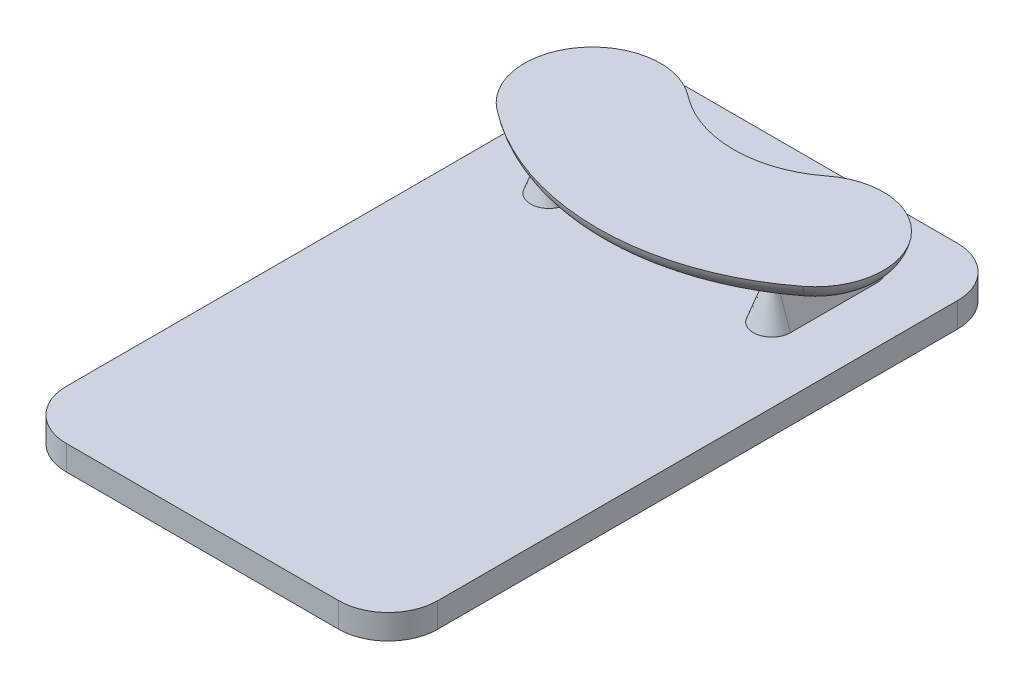
ISO-10303-21;
HEADER;
FILE_DESCRIPTION(('STEP AP214'),'2;1');
FILE_NAME('part.step','',(''),(''),'','','');
FILE_SCHEMA(('AUTOMOTIVE_DESIGN { 1 0 10303 214 1 1 1 1 }'));
ENDSEC;
DATA;
#1=APPLICATION_CONTEXT('core data for automotive mechanical design processes');
#2=APPLICATION_PROTOCOL_DEFINITION('international standard','automotive_design',2000,#1);
#3=PRODUCT_CONTEXT('',#1,'mechanical');
#4=PRODUCT('Part','Part','',(#3));
#5=PRODUCT_RELATED_PRODUCT_CATEGORY('part','',(#4));
#6=PRODUCT_DEFINITION_FORMATION('','',#4);
#7=PRODUCT_DEFINITION_CONTEXT('part definition',#1,'design');
#8=PRODUCT_DEFINITION('design','',#6,#7);
#9=PRODUCT_DEFINITION_SHAPE('','',#8);
#10=(LENGTH_UNIT() NAMED_UNIT(*) SI_UNIT(.MILLI.,.METRE.));
#11=(NAMED_UNIT(*) PLANE_ANGLE_UNIT() SI_UNIT($,.RADIAN.));
#12=(NAMED_UNIT(*) SI_UNIT($,.STERADIAN.) SOLID_ANGLE_UNIT());
#13=UNCERTAINTY_MEASURE_WITH_UNIT(LENGTH_MEASURE(1.E-05),#10,'distance_accuracy_value','');
#14=(GEOMETRIC_REPRESENTATION_CONTEXT(3) GLOBAL_UNCERTAINTY_ASSIGNED_CONTEXT((#13)) GLOBAL_UNIT_ASSIGNED_CONTEXT((#10,
#11,#12)) REPRESENTATION_CONTEXT('',''));
#15=CARTESIAN_POINT('',(0.,0.,0.));
#16=DIRECTION('',(0.,0.,1.));
#17=DIRECTION('',(1.,0.,0.));
#18=AXIS2_PLACEMENT_3D('',#15,#16,#17);
#19=CARTESIAN_POINT('',(0.,20.,0.));
#20=DIRECTION('',(0.,1.,0.));
#21=DIRECTION('',(0.,0.,1.));
#22=AXIS2_PLACEMENT_3D('',#19,#20,#21);
#23=PLANE('',#22);
#24=DIRECTION('',(1.,0.,0.));
#25=VECTOR('',#24,1.);
#26=CARTESIAN_POINT('',(-88.9739336098494,20.,413.488444626586));
#27=LINE('',#26,#25);
#28=CARTESIAN_POINT('',(-48.9739336098494,20.,413.488444626586));
#29=VERTEX_POINT('',#28);
#30=CARTESIAN_POINT('',(171.026066390151,20.,413.488444626586));
#31=VERTEX_POINT('',#30);
#32=EDGE_CURVE('E276',#29,#31,#27,.T.);
#33=ORIENTED_EDGE('',*,*,#32,.T.);
#34=CARTESIAN_POINT('',(171.026066390151,20.,373.488444626586));
#35=DIRECTION('',(0.,1.,0.));
#36=DIRECTION('',(0.,0.,1.));
#37=AXIS2_PLACEMENT_3D('',#34,#35,#36);
#38=CIRCLE('',#37,40.);
#39=CARTESIAN_POINT('',(211.026066390151,20.,373.488444626586));
#40=VERTEX_POINT('',#39);
#41=EDGE_CURVE('E333',#31,#40,#38,.T.);
#42=ORIENTED_EDGE('',*,*,#41,.T.);
#43=DIRECTION('',(0.,0.,-1.));
#44=VECTOR('',#43,1.);
#45=CARTESIAN_POINT('',(211.026066390151,20.,-86.5115553734145));
#46=LINE('',#45,#44);
#47=CARTESIAN_POINT('',(211.026066390151,20.,-46.5115553734145));
#48=VERTEX_POINT('',#47);
#49=EDGE_CURVE('E280',#40,#48,#46,.T.);
#50=ORIENTED_EDGE('',*,*,#49,.T.);
#51=CARTESIAN_POINT('',(171.026066390151,20.,-46.5115553734145));
#52=DIRECTION('',(0.,1.,0.));
#53=DIRECTION('',(0.,0.,1.));
#54=AXIS2_PLACEMENT_3D('',#51,#52,#53);
#55=CIRCLE('',#54,40.);
#56=CARTESIAN_POINT('',(171.026066390151,20.,-86.5115553734145));
#57=VERTEX_POINT('',#56);
#58=EDGE_CURVE('E303',#48,#57,#55,.T.);
#59=ORIENTED_EDGE('',*,*,#58,.T.);
#60=DIRECTION('',(-1.,0.,0.));
#61=VECTOR('',#60,1.);
#62=CARTESIAN_POINT('',(-88.9739336098494,20.,-86.5115553734145));
#63=LINE('',#62,#61);
#64=CARTESIAN_POINT('',(-48.9739336098494,20.,-86.5115553734145));
#65=VERTEX_POINT('',#64);
#66=EDGE_CURVE('E282',#57,#65,#63,.T.);
#67=ORIENTED_EDGE('',*,*,#66,.T.);
#68=CARTESIAN_POINT('',(-48.9739336098494,20.,-46.5115553734145));
#69=DIRECTION('',(0.,1.,0.));
#70=DIRECTION('',(0.,0.,1.));
#71=AXIS2_PLACEMENT_3D('',#68,#69,#70);
#72=CIRCLE('',#71,40.);
#73=CARTESIAN_POINT('',(-88.9739336098494,20.,-46.5115553734145));
#74=VERTEX_POINT('',#73);
#75=EDGE_CURVE('E313',#65,#74,#72,.T.);
#76=ORIENTED_EDGE('',*,*,#75,.T.);
#77=DIRECTION('',(0.,0.,1.));
#78=VECTOR('',#77,1.);
#79=CARTESIAN_POINT('',(-88.9739336098494,20.,-86.5115553734145));
#80=LINE('',#79,#78);
#81=CARTESIAN_POINT('',(-88.9739336098494,20.,373.488444626586));
#82=VERTEX_POINT('',#81);
#83=EDGE_CURVE('E273',#74,#82,#80,.T.);
#84=ORIENTED_EDGE('',*,*,#83,.T.);
#85=CARTESIAN_POINT('',(-48.9739336098494,20.,373.488444626586));
#86=DIRECTION('',(0.,1.,0.));
#87=DIRECTION('',(0.,0.,1.));
#88=AXIS2_PLACEMENT_3D('',#85,#86,#87);
#89=CIRCLE('',#88,40.);
#90=EDGE_CURVE('E323',#82,#29,#89,.T.);
#91=ORIENTED_EDGE('',*,*,#90,.T.);
#92=EDGE_LOOP('',(#33,#42,#50,#59,#67,#76,#84,#91));
#93=FACE_BOUND('',#92,.T.);
#94=DIRECTION('',(0.,0.,1.));
#95=VECTOR('',#94,1.);
#96=CARTESIAN_POINT('',(-43.9739336098495,20.,-26.5115553734145));
#97=LINE('',#96,#95);
#98=CARTESIAN_POINT('',(-43.9739336098495,20.,-26.5115553734145));
#99=VERTEX_POINT('',#98);
#100=CARTESIAN_POINT('',(-43.9739336098494,20.,43.4884446265855));
#101=VERTEX_POINT('',#100);
#102=EDGE_CURVE('E242',#99,#101,#97,.T.);
#103=ORIENTED_EDGE('',*,*,#102,.F.);
#104=CARTESIAN_POINT('',(-28.9739336098495,20.,-26.5115553734145));
#105=DIRECTION('',(0.,1.,0.));
#106=DIRECTION('',(0.,0.,1.));
#107=AXIS2_PLACEMENT_3D('',#104,#105,#106);
#108=CIRCLE('',#107,15.);
#109=CARTESIAN_POINT('',(-13.9739336098495,20.,-26.5115553734145));
#110=VERTEX_POINT('',#109);
#111=EDGE_CURVE('E220',#110,#99,#108,.T.);
#112=ORIENTED_EDGE('',*,*,#111,.F.);
#113=DIRECTION('',(0.,0.,-1.));
#114=VECTOR('',#113,1.);
#115=CARTESIAN_POINT('',(-13.9739336098495,20.,-26.5115553734145));
#116=LINE('',#115,#114);
#117=CARTESIAN_POINT('',(-13.9739336098494,20.,43.4884446265855));
#118=VERTEX_POINT('',#117);
#119=EDGE_CURVE('E247',#118,#110,#116,.T.);
#120=ORIENTED_EDGE('',*,*,#119,.F.);
#121=CARTESIAN_POINT('',(-28.9739336098494,20.,43.4884446265855));
#122=DIRECTION('',(0.,1.,0.));
#123=DIRECTION('',(0.,0.,1.));
#124=AXIS2_PLACEMENT_3D('',#121,#122,#123);
#125=CIRCLE('',#124,15.);
#126=EDGE_CURVE('E244',#101,#118,#125,.T.);
#127=ORIENTED_EDGE('',*,*,#126,.F.);
#128=EDGE_LOOP('',(#103,#112,#120,#127));
#129=FACE_BOUND('',#128,.T.);
#130=DIRECTION('',(0.,0.,1.));
#131=VECTOR('',#130,1.);
#132=CARTESIAN_POINT('',(136.026066390151,20.,-26.5115553734145));
#133=LINE('',#132,#131);
#134=CARTESIAN_POINT('',(136.026066390151,20.,-26.5115553734145));
#135=VERTEX_POINT('',#134);
#136=CARTESIAN_POINT('',(136.026066390151,20.,43.4884446265855));
#137=VERTEX_POINT('',#136);
#138=EDGE_CURVE('E210',#135,#137,#133,.T.);
#139=ORIENTED_EDGE('',*,*,#138,.F.);
#140=CARTESIAN_POINT('',(151.026066390151,20.,-26.5115553734145));
#141=DIRECTION('',(0.,1.,0.));
#142=DIRECTION('',(0.,0.,1.));
#143=AXIS2_PLACEMENT_3D('',#140,#141,#142);
#144=CIRCLE('',#143,15.);
#145=CARTESIAN_POINT('',(166.026066390151,20.,-26.5115553734145));
#146=VERTEX_POINT('',#145);
#147=EDGE_CURVE('E207',#146,#135,#144,.T.);
#148=ORIENTED_EDGE('',*,*,#147,.F.);
#149=DIRECTION('',(0.,0.,-1.));
#150=VECTOR('',#149,1.);
#151=CARTESIAN_POINT('',(166.026066390151,20.,-26.5115553734145));
#152=LINE('',#151,#150);
#153=CARTESIAN_POINT('',(166.026066390151,20.,43.4884446265855));
#154=VERTEX_POINT('',#153);
#155=EDGE_CURVE('E215',#154,#146,#152,.T.);
#156=ORIENTED_EDGE('',*,*,#155,.F.);
#157=CARTESIAN_POINT('',(151.026066390151,20.,43.4884446265855));
#158=DIRECTION('',(0.,1.,0.));
#159=DIRECTION('',(0.,0.,1.));
#160=AXIS2_PLACEMENT_3D('',#157,#158,#159);
#161=CIRCLE('',#160,15.);
#162=EDGE_CURVE('E212',#137,#154,#161,.T.);
#163=ORIENTED_EDGE('',*,*,#162,.F.);
#164=EDGE_LOOP('',(#139,#148,#156,#163));
#165=FACE_BOUND('',#164,.T.);
#166=ADVANCED_FACE('F33',(#93,#129,#165),#23,.T.);
#167=CARTESIAN_POINT('',(171.026066390151,20.,373.488444626586));
#168=DIRECTION('',(0.,1.,0.));
#169=DIRECTION('',(0.,0.,1.));
#170=AXIS2_PLACEMENT_3D('',#167,#168,#169);
#171=CYLINDRICAL_SURFACE('',#170,40.);
#172=DIRECTION('',(0.,1.,0.));
#173=VECTOR('',#172,1.);
#174=CARTESIAN_POINT('',(171.026066390151,20.,413.488444626586));
#175=LINE('',#174,#173);
#176=CARTESIAN_POINT('',(171.026066390151,0.,413.488444626586));
#177=VERTEX_POINT('',#176);
#178=EDGE_CURVE('E325',#177,#31,#175,.T.);
#179=ORIENTED_EDGE('',*,*,#178,.F.);
#180=CARTESIAN_POINT('',(171.026066390151,0.,373.488444626586));
#181=DIRECTION('',(0.,1.,0.));
#182=DIRECTION('',(0.,0.,1.));
#183=AXIS2_PLACEMENT_3D('',#180,#181,#182);
#184=CIRCLE('',#183,40.);
#185=CARTESIAN_POINT('',(211.026066390151,0.,373.488444626586));
#186=VERTEX_POINT('',#185);
#187=EDGE_CURVE('E331',#186,#177,#184,.F.);
#188=ORIENTED_EDGE('',*,*,#187,.F.);
#189=DIRECTION('',(0.,1.,0.));
#190=VECTOR('',#189,1.);
#191=CARTESIAN_POINT('',(211.026066390151,20.,373.488444626586));
#192=LINE('',#191,#190);
#193=EDGE_CURVE('E328',#40,#186,#192,.F.);
#194=ORIENTED_EDGE('',*,*,#193,.F.);
#195=ORIENTED_EDGE('',*,*,#41,.F.);
#196=EDGE_LOOP('',(#179,#188,#194,#195));
#197=FACE_BOUND('',#196,.T.);
#198=ADVANCED_FACE('F373',(#197),#171,.T.);
#199=CARTESIAN_POINT('',(-48.9739336098494,20.,373.488444626586));
#200=DIRECTION('',(0.,1.,0.));
#201=DIRECTION('',(0.,0.,1.));
#202=AXIS2_PLACEMENT_3D('',#199,#200,#201);
#203=CYLINDRICAL_SURFACE('',#202,40.);
#204=DIRECTION('',(0.,1.,0.));
#205=VECTOR('',#204,1.);
#206=CARTESIAN_POINT('',(-88.9739336098494,20.,373.488444626586));
#207=LINE('',#206,#205);
#208=CARTESIAN_POINT('',(-88.9739336098494,0.,373.488444626586));
#209=VERTEX_POINT('',#208);
#210=EDGE_CURVE('E315',#209,#82,#207,.T.);
#211=ORIENTED_EDGE('',*,*,#210,.F.);
#212=CARTESIAN_POINT('',(-48.9739336098494,0.,373.488444626586));
#213=DIRECTION('',(0.,1.,0.));
#214=DIRECTION('',(0.,0.,1.));
#215=AXIS2_PLACEMENT_3D('',#212,#213,#214);
#216=CIRCLE('',#215,40.);
#217=CARTESIAN_POINT('',(-48.9739336098494,0.,413.488444626586));
#218=VERTEX_POINT('',#217);
#219=EDGE_CURVE('E321',#218,#209,#216,.F.);
#220=ORIENTED_EDGE('',*,*,#219,.F.);
#221=DIRECTION('',(0.,1.,0.));
#222=VECTOR('',#221,1.);
#223=CARTESIAN_POINT('',(-48.9739336098494,20.,413.488444626586));
#224=LINE('',#223,#222);
#225=EDGE_CURVE('E318',#29,#218,#224,.F.);
#226=ORIENTED_EDGE('',*,*,#225,.F.);
#227=ORIENTED_EDGE('',*,*,#90,.F.);
#228=EDGE_LOOP('',(#211,#220,#226,#227));
#229=FACE_BOUND('',#228,.T.);
#230=ADVANCED_FACE('F381',(#229),#203,.T.);
#231=CARTESIAN_POINT('',(-48.9739336098494,20.,-46.5115553734145));
#232=DIRECTION('',(0.,1.,0.));
#233=DIRECTION('',(0.,0.,1.));
#234=AXIS2_PLACEMENT_3D('',#231,#232,#233);
#235=CYLINDRICAL_SURFACE('',#234,40.);
#236=DIRECTION('',(0.,1.,0.));
#237=VECTOR('',#236,1.);
#238=CARTESIAN_POINT('',(-48.9739336098494,20.,-86.5115553734145));
#239=LINE('',#238,#237);
#240=CARTESIAN_POINT('',(-48.9739336098494,0.,-86.5115553734145));
#241=VERTEX_POINT('',#240);
#242=EDGE_CURVE('E305',#241,#65,#239,.T.);
#243=ORIENTED_EDGE('',*,*,#242,.F.);
#244=CARTESIAN_POINT('',(-48.9739336098494,0.,-46.5115553734145));
#245=DIRECTION('',(0.,1.,0.));
#246=DIRECTION('',(0.,0.,1.));
#247=AXIS2_PLACEMENT_3D('',#244,#245,#246);
#248=CIRCLE('',#247,40.);
#249=CARTESIAN_POINT('',(-88.9739336098494,0.,-46.5115553734145));
#250=VERTEX_POINT('',#249);
#251=EDGE_CURVE('E311',#250,#241,#248,.F.);
#252=ORIENTED_EDGE('',*,*,#251,.F.);
#253=DIRECTION('',(0.,1.,0.));
#254=VECTOR('',#253,1.);
#255=CARTESIAN_POINT('',(-88.9739336098494,20.,-46.5115553734145));
#256=LINE('',#255,#254);
#257=EDGE_CURVE('E308',#74,#250,#256,.F.);
#258=ORIENTED_EDGE('',*,*,#257,.F.);
#259=ORIENTED_EDGE('',*,*,#75,.F.);
#260=EDGE_LOOP('',(#243,#252,#258,#259));
#261=FACE_BOUND('',#260,.T.);
#262=ADVANCED_FACE('F412',(#261),#235,.T.);
#263=CARTESIAN_POINT('',(171.026066390151,20.,-46.5115553734145));
#264=DIRECTION('',(0.,1.,0.));
#265=DIRECTION('',(0.,0.,1.));
#266=AXIS2_PLACEMENT_3D('',#263,#264,#265);
#267=CYLINDRICAL_SURFACE('',#266,40.);
#268=DIRECTION('',(0.,1.,0.));
#269=VECTOR('',#268,1.);
#270=CARTESIAN_POINT('',(211.026066390151,20.,-46.5115553734145));
#271=LINE('',#270,#269);
#272=CARTESIAN_POINT('',(211.026066390151,0.,-46.5115553734145));
#273=VERTEX_POINT('',#272);
#274=EDGE_CURVE('E285',#273,#48,#271,.T.);
#275=ORIENTED_EDGE('',*,*,#274,.F.);
#276=CARTESIAN_POINT('',(171.026066390151,0.,-46.5115553734145));
#277=DIRECTION('',(0.,1.,0.));
#278=DIRECTION('',(0.,0.,1.));
#279=AXIS2_PLACEMENT_3D('',#276,#277,#278);
#280=CIRCLE('',#279,40.);
#281=CARTESIAN_POINT('',(171.026066390151,0.,-86.5115553734145));
#282=VERTEX_POINT('',#281);
#283=EDGE_CURVE('E300',#282,#273,#280,.F.);
#284=ORIENTED_EDGE('',*,*,#283,.F.);
#285=DIRECTION('',(0.,1.,0.));
#286=VECTOR('',#285,1.);
#287=CARTESIAN_POINT('',(171.026066390151,20.,-86.5115553734145));
#288=LINE('',#287,#286);
#289=EDGE_CURVE('E297',#57,#282,#288,.F.);
#290=ORIENTED_EDGE('',*,*,#289,.F.);
#291=ORIENTED_EDGE('',*,*,#58,.F.);
#292=EDGE_LOOP('',(#275,#284,#290,#291));
#293=FACE_BOUND('',#292,.T.);
#294=ADVANCED_FACE('F408',(#293),#267,.T.);
#295=CARTESIAN_POINT('',(-88.9739336098494,20.,-86.5115553734145));
#296=DIRECTION('',(1.,0.,0.));
#297=DIRECTION('',(0.,0.,-1.));
#298=AXIS2_PLACEMENT_3D('',#295,#296,#297);
#299=PLANE('',#298);
#300=DIRECTION('',(0.,0.,1.));
#301=VECTOR('',#300,1.);
#302=CARTESIAN_POINT('',(-88.9739336098494,0.,-86.5115553734145));
#303=LINE('',#302,#301);
#304=EDGE_CURVE('E252',#250,#209,#303,.T.);
#305=ORIENTED_EDGE('',*,*,#304,.T.);
#306=ORIENTED_EDGE('',*,*,#210,.T.);
#307=ORIENTED_EDGE('',*,*,#83,.F.);
#308=ORIENTED_EDGE('',*,*,#257,.T.);
#309=EDGE_LOOP('',(#305,#306,#307,#308));
#310=FACE_BOUND('',#309,.T.);
#311=ADVANCED_FACE('F404',(#310),#299,.F.);
#312=CARTESIAN_POINT('',(-88.9739336098494,20.,413.488444626586));
#313=DIRECTION('',(0.,0.,-1.));
#314=DIRECTION('',(-1.,0.,0.));
#315=AXIS2_PLACEMENT_3D('',#312,#313,#314);
#316=PLANE('',#315);
#317=DIRECTION('',(1.,0.,0.));
#318=VECTOR('',#317,1.);
#319=CARTESIAN_POINT('',(-88.9739336098494,0.,413.488444626586));
#320=LINE('',#319,#318);
#321=EDGE_CURVE('E288',#218,#177,#320,.T.);
#322=ORIENTED_EDGE('',*,*,#321,.T.);
#323=ORIENTED_EDGE('',*,*,#178,.T.);
#324=ORIENTED_EDGE('',*,*,#32,.F.);
#325=ORIENTED_EDGE('',*,*,#225,.T.);
#326=EDGE_LOOP('',(#322,#323,#324,#325));
#327=FACE_BOUND('',#326,.T.);
#328=ADVANCED_FACE('F400',(#327),#316,.F.);
#329=CARTESIAN_POINT('',(211.026066390151,20.,-86.5115553734145));
#330=DIRECTION('',(-1.,0.,0.));
#331=DIRECTION('',(0.,0.,1.));
#332=AXIS2_PLACEMENT_3D('',#329,#330,#331);
#333=PLANE('',#332);
#334=ORIENTED_EDGE('',*,*,#49,.F.);
#335=ORIENTED_EDGE('',*,*,#193,.T.);
#336=DIRECTION('',(0.,0.,-1.));
#337=VECTOR('',#336,1.);
#338=CARTESIAN_POINT('',(211.026066390151,0.,-86.5115553734145));
#339=LINE('',#338,#337);
#340=EDGE_CURVE('E291',#186,#273,#339,.T.);
#341=ORIENTED_EDGE('',*,*,#340,.T.);
#342=ORIENTED_EDGE('',*,*,#274,.T.);
#343=EDGE_LOOP('',(#334,#335,#341,#342));
#344=FACE_BOUND('',#343,.T.);
#345=ADVANCED_FACE('F396',(#344),#333,.F.);
#346=CARTESIAN_POINT('',(-88.9739336098494,20.,-86.5115553734145));
#347=DIRECTION('',(0.,0.,1.));
#348=DIRECTION('',(1.,0.,0.));
#349=AXIS2_PLACEMENT_3D('',#346,#347,#348);
#350=PLANE('',#349);
#351=DIRECTION('',(-1.,0.,0.));
#352=VECTOR('',#351,1.);
#353=CARTESIAN_POINT('',(-88.9739336098494,0.,-86.5115553734145));
#354=LINE('',#353,#352);
#355=EDGE_CURVE('E277',#282,#241,#354,.T.);
#356=ORIENTED_EDGE('',*,*,#355,.T.);
#357=ORIENTED_EDGE('',*,*,#242,.T.);
#358=ORIENTED_EDGE('',*,*,#66,.F.);
#359=ORIENTED_EDGE('',*,*,#289,.T.);
#360=EDGE_LOOP('',(#356,#357,#358,#359));
#361=FACE_BOUND('',#360,.T.);
#362=ADVANCED_FACE('F392',(#361),#350,.F.);
#363=CARTESIAN_POINT('',(0.,0.,0.));
#364=DIRECTION('',(0.,1.,0.));
#365=DIRECTION('',(0.,0.,1.));
#366=AXIS2_PLACEMENT_3D('',#363,#364,#365);
#367=PLANE('',#366);
#368=ORIENTED_EDGE('',*,*,#340,.F.);
#369=ORIENTED_EDGE('',*,*,#187,.T.);
#370=ORIENTED_EDGE('',*,*,#321,.F.);
#371=ORIENTED_EDGE('',*,*,#219,.T.);
#372=ORIENTED_EDGE('',*,*,#304,.F.);
#373=ORIENTED_EDGE('',*,*,#251,.T.);
#374=ORIENTED_EDGE('',*,*,#355,.F.);
#375=ORIENTED_EDGE('',*,*,#283,.T.);
#376=EDGE_LOOP('',(#368,#369,#370,#371,#372,#373,#374,#375));
#377=FACE_BOUND('',#376,.T.);
#378=ADVANCED_FACE('F388',(#377),#367,.F.);
#379=CARTESIAN_POINT('',(-28.9739336098495,20.,-26.5115553734145));
#380=DIRECTION('',(0.,-1.,0.));
#381=DIRECTION('',(0.,0.,1.));
#382=AXIS2_PLACEMENT_3D('',#379,#380,#381);
#383=CONICAL_SURFACE('',#382,15.,0.349065850398867);
#384=ORIENTED_EDGE('',*,*,#111,.T.);
#385=DIRECTION('',(-0.342020143325669,-0.939692620785908,0.));
#386=VECTOR('',#385,1.);
#387=CARTESIAN_POINT('',(-43.9739336098495,20.,-26.5115553734145));
#388=LINE('',#387,#386);
#389=CARTESIAN_POINT('',(-33.0548265818634,50.,-26.5115553734145));
#390=VERTEX_POINT('',#389);
#391=EDGE_CURVE('E250',#390,#99,#388,.T.);
#392=ORIENTED_EDGE('',*,*,#391,.F.);
#393=CARTESIAN_POINT('',(-28.9739336098495,50.,-26.5115553734145));
#394=DIRECTION('',(0.,1.,0.));
#395=DIRECTION('',(0.,0.,1.));
#396=AXIS2_PLACEMENT_3D('',#393,#394,#395);
#397=CIRCLE('',#396,4.0808929720139);
#398=CARTESIAN_POINT('',(-33.0513789218682,50.,-26.6792669607574));
#399=VERTEX_POINT('',#398);
#400=EDGE_CURVE('E249',#399,#390,#397,.T.);
#401=ORIENTED_EDGE('',*,*,#400,.F.);
#402=CARTESIAN_POINT('',(-33.0513789218682,50.,-26.6792669607574));
#403=CARTESIAN_POINT('',(-33.0469867001525,49.9999930657761,-26.7863758750388));
#404=CARTESIAN_POINT('',(-33.038042353523,50.0008408608023,-26.8932872056415));
#405=CARTESIAN_POINT('',(-33.0112104817047,50.0041266451598,-27.1059335603979));
#406=CARTESIAN_POINT('',(-32.9933249772071,50.0065642752281,-27.2116688448199));
#407=CARTESIAN_POINT('',(-32.9488208418149,50.0129032901162,-27.4209906582093));
#408=CARTESIAN_POINT('',(-32.9222223402743,50.0168013040136,-27.5245815602686));
#409=CARTESIAN_POINT('',(-32.8605513367442,50.0258964230364,-27.7291238054654));
#410=CARTESIAN_POINT('',(-32.8254785715546,50.0310935685115,-27.8300750665111));
#411=CARTESIAN_POINT('',(-32.7080048762913,50.0483586557788,-28.1278643884535));
#412=CARTESIAN_POINT('',(-32.6132907052186,50.0621091817786,-28.3199071362719));
#413=CARTESIAN_POINT('',(-32.3941889301757,50.0923838199792,-28.6859031877495));
#414=CARTESIAN_POINT('',(-32.2697904451789,50.1089089485732,-28.859849824479));
#415=CARTESIAN_POINT('',(-31.9900877848191,50.143510790436,-29.1913878794933));
#416=CARTESIAN_POINT('',(-31.8338523476355,50.1616216004735,-29.3481912704985));
#417=CARTESIAN_POINT('',(-31.4979242378072,50.1969000264844,-29.6343838156535));
#418=CARTESIAN_POINT('',(-31.3182263820894,50.2140674328567,-29.7637668957786));
#419=CARTESIAN_POINT('',(-30.9336538730108,50.2462414776832,-29.996072817658));
#420=CARTESIAN_POINT('',(-30.7281224138561,50.2611525867952,-30.0979229732806));
#421=CARTESIAN_POINT('',(-30.3028804548504,50.286486618094,-30.2665138726575));
#422=CARTESIAN_POINT('',(-30.0831692927114,50.2969093304675,-30.3332529751536));
#423=CARTESIAN_POINT('',(-29.6322591924711,50.3122908692301,-30.4306726569534));
#424=CARTESIAN_POINT('',(-29.4009378340879,50.3171659341174,-30.4608009125922));
#425=CARTESIAN_POINT('',(-28.9364520658985,50.3206479660533,-30.4823775881734));
#426=CARTESIAN_POINT('',(-28.7032876246808,50.3192548260422,-30.4738253474614));
#427=CARTESIAN_POINT('',(-28.2412179224806,50.3103398345116,-30.4182065228483));
#428=CARTESIAN_POINT('',(-28.0123226264582,50.3028051276942,-30.3710591521759));
#429=CARTESIAN_POINT('',(-27.5657808749866,50.282399912291,-30.2393740586295));
#430=CARTESIAN_POINT('',(-27.3481354087884,50.2695289353562,-30.1548330537816));
#431=CARTESIAN_POINT('',(-26.9304445324034,50.2398581992476,-29.9505820941771));
#432=CARTESIAN_POINT('',(-26.7303895334291,50.2230605990274,-29.8308914563153));
#433=CARTESIAN_POINT('',(-26.3536314769643,50.1874071409447,-29.5594290388047));
#434=CARTESIAN_POINT('',(-26.1769260396586,50.1685514931991,-29.4076605326757));
#435=CARTESIAN_POINT('',(-25.8536850594707,50.1311402032576,-29.0773342793725));
#436=CARTESIAN_POINT('',(-25.7068875992786,50.1125833957632,-28.8990350815536));
#437=CARTESIAN_POINT('',(-25.5115840790829,50.086579828883,-28.6146249920088));
#438=CARTESIAN_POINT('',(-25.4506103936736,50.0782139780039,-28.5169481447338));
#439=CARTESIAN_POINT('',(-25.3374481663327,50.0623686398269,-28.3165779625584));
#440=CARTESIAN_POINT('',(-25.2852561644051,50.0548888037835,-28.2138866240479));
#441=CARTESIAN_POINT('',(-25.186933309772,50.0406184874699,-27.9971426218933));
#442=CARTESIAN_POINT('',(-25.1414491728159,50.0339085912827,-27.8827909158395));
#443=CARTESIAN_POINT('',(-25.0615552203853,50.0221052733709,-27.6501944068009));
#444=CARTESIAN_POINT('',(-25.027145657436,50.0170118885063,-27.5319495151105));
#445=CARTESIAN_POINT('',(-24.9697174206806,50.0086906924272,-27.2921787154173));
#446=CARTESIAN_POINT('',(-24.9467426343427,50.0054700611356,-27.1706420255076));
#447=CARTESIAN_POINT('',(-24.9126465525511,50.0011182158265,-26.9258446091127));
#448=CARTESIAN_POINT('',(-24.9015288817932,49.9999876406574,-26.8025833670954));
#449=CARTESIAN_POINT('',(-24.8964797455426,50.,-26.6790589061588));
#450=B_SPLINE_CURVE_WITH_KNOTS('',3,(#402,#403,#404,#405,#406,#407,#408,#409,#410,#411,#412,
#413,#414,#415,#416,#417,#418,#419,#420,#421,#422,#423,#424,#425,#426,#427,#428,#429,#430,#431,
#432,#433,#434,#435,#436,#437,#438,#439,#440,#441,#442,#443,#444,#445,#446,#447,#448,#449),
.UNSPECIFIED.,.F.,.F.,(4,2,2,2,2,2,2,2,2,2,2,2,2,2,2,2,2,2,2,2,2,2,2,4),(0.,0.321480249392461,
0.642887877450452,0.96355814387889,1.28423837120503,1.92478271909547,2.56556222538199,
3.22882535557012,3.89223525562995,4.57864164587852,5.26508011918633,5.96175076407222,
6.65843330798419,7.35657787794238,8.05478373499426,8.7526066005656,9.45035828824819,
10.1417085264915,10.4876874983537,10.8335298331566,11.2027109410914,11.5719004665829,
11.9424962457734,12.3132052828875),.UNSPECIFIED.);
#451=CARTESIAN_POINT('',(-24.8964797455426,50.,-26.6790589061588));
#452=VERTEX_POINT('',#451);
#453=EDGE_CURVE('E11',#399,#452,#450,.T.);
#454=ORIENTED_EDGE('',*,*,#453,.T.);
#455=CARTESIAN_POINT('',(-24.8930406378356,50.,-26.5115553734145));
#456=VERTEX_POINT('',#455);
#457=EDGE_CURVE('E262',#456,#452,#397,.T.);
#458=ORIENTED_EDGE('',*,*,#457,.F.);
#459=DIRECTION('',(0.342020143325669,-0.939692620785908,0.));
#460=VECTOR('',#459,1.);
#461=CARTESIAN_POINT('',(-13.9739336098495,20.,-26.5115553734145));
#462=LINE('',#461,#460);
#463=EDGE_CURVE('E254',#456,#110,#462,.T.);
#464=ORIENTED_EDGE('',*,*,#463,.T.);
#465=EDGE_LOOP('',(#384,#392,#401,#454,#458,#464));
#466=FACE_BOUND('',#465,.T.);
#467=ADVANCED_FACE('F391',(#466),#383,.T.);
#468=CARTESIAN_POINT('',(-43.9739336098495,20.,-26.5115553734145));
#469=DIRECTION('',(-0.939692620785908,0.342020143325669,0.));
#470=DIRECTION('',(-0.342020143325669,-0.939692620785908,0.));
#471=AXIS2_PLACEMENT_3D('',#468,#469,#470);
#472=PLANE('',#471);
#473=ORIENTED_EDGE('',*,*,#102,.T.);
#474=DIRECTION('',(-0.342020143325669,-0.939692620785908,0.));
#475=VECTOR('',#474,1.);
#476=CARTESIAN_POINT('',(-43.9739336098494,20.,43.4884446265855));
#477=LINE('',#476,#475);
#478=CARTESIAN_POINT('',(-33.0548265818634,50.,43.4884446265855));
#479=VERTEX_POINT('',#478);
#480=EDGE_CURVE('E253',#479,#101,#477,.T.);
#481=ORIENTED_EDGE('',*,*,#480,.F.);
#482=DIRECTION('',(0.,0.,-1.));
#483=VECTOR('',#482,1.);
#484=CARTESIAN_POINT('',(-33.0548265818634,50.,-26.5115553734145));
#485=LINE('',#484,#483);
#486=EDGE_CURVE('E265',#390,#479,#485,.F.);
#487=ORIENTED_EDGE('',*,*,#486,.F.);
#488=ORIENTED_EDGE('',*,*,#391,.T.);
#489=EDGE_LOOP('',(#473,#481,#487,#488));
#490=FACE_BOUND('',#489,.T.);
#491=ADVANCED_FACE('F386',(#490),#472,.T.);
#492=CARTESIAN_POINT('',(-28.9739336098494,20.,43.4884446265855));
#493=DIRECTION('',(0.,-1.,0.));
#494=DIRECTION('',(0.,0.,1.));
#495=AXIS2_PLACEMENT_3D('',#492,#493,#494);
#496=CONICAL_SURFACE('',#495,15.,0.349065850398867);
#497=ORIENTED_EDGE('',*,*,#126,.T.);
#498=DIRECTION('',(0.342020143325669,-0.939692620785908,0.));
#499=VECTOR('',#498,1.);
#500=CARTESIAN_POINT('',(-13.9739336098494,20.,43.4884446265855));
#501=LINE('',#500,#499);
#502=CARTESIAN_POINT('',(-24.8930406378355,50.,43.4884446265855));
#503=VERTEX_POINT('',#502);
#504=EDGE_CURVE('E257',#503,#118,#501,.T.);
#505=ORIENTED_EDGE('',*,*,#504,.F.);
#506=CARTESIAN_POINT('',(-28.9739336098494,50.,43.4884446265855));
#507=DIRECTION('',(0.,1.,0.));
#508=DIRECTION('',(0.,0.,1.));
#509=AXIS2_PLACEMENT_3D('',#506,#507,#508);
#510=CIRCLE('',#509,4.0808929720139);
#511=EDGE_CURVE('E268',#479,#503,#510,.T.);
#512=ORIENTED_EDGE('',*,*,#511,.F.);
#513=ORIENTED_EDGE('',*,*,#480,.T.);
#514=EDGE_LOOP('',(#497,#505,#512,#513));
#515=FACE_BOUND('',#514,.T.);
#516=ADVANCED_FACE('F485',(#515),#496,.T.);
#517=CARTESIAN_POINT('',(-13.9739336098495,20.,-26.5115553734145));
#518=DIRECTION('',(0.939692620785908,0.342020143325669,0.));
#519=DIRECTION('',(-0.342020143325669,0.939692620785908,0.));
#520=AXIS2_PLACEMENT_3D('',#517,#518,#519);
#521=PLANE('',#520);
#522=ORIENTED_EDGE('',*,*,#119,.T.);
#523=ORIENTED_EDGE('',*,*,#463,.F.);
#524=DIRECTION('',(0.,0.,1.));
#525=VECTOR('',#524,1.);
#526=CARTESIAN_POINT('',(-24.8930406378356,50.,-26.5115553734145));
#527=LINE('',#526,#525);
#528=EDGE_CURVE('E258',#503,#456,#527,.F.);
#529=ORIENTED_EDGE('',*,*,#528,.F.);
#530=ORIENTED_EDGE('',*,*,#504,.T.);
#531=EDGE_LOOP('',(#522,#523,#529,#530));
#532=FACE_BOUND('',#531,.T.);
#533=ADVANCED_FACE('F492',(#532),#521,.T.);
#534=CARTESIAN_POINT('',(151.026066390151,20.,-26.5115553734145));
#535=DIRECTION('',(0.,-1.,0.));
#536=DIRECTION('',(0.,0.,1.));
#537=AXIS2_PLACEMENT_3D('',#534,#535,#536);
#538=CONICAL_SURFACE('',#537,15.,0.349065850398867);
#539=ORIENTED_EDGE('',*,*,#147,.T.);
#540=DIRECTION('',(-0.342020143325669,-0.939692620785908,0.));
#541=VECTOR('',#540,1.);
#542=CARTESIAN_POINT('',(136.026066390151,20.,-26.5115553734145));
#543=LINE('',#542,#541);
#544=CARTESIAN_POINT('',(146.945173418137,50.,-26.5115553734145));
#545=VERTEX_POINT('',#544);
#546=EDGE_CURVE('E218',#545,#135,#543,.T.);
#547=ORIENTED_EDGE('',*,*,#546,.F.);
#548=CARTESIAN_POINT('',(151.026066390151,50.,-26.5115553734145));
#549=DIRECTION('',(0.,1.,0.));
#550=DIRECTION('',(0.,0.,1.));
#551=AXIS2_PLACEMENT_3D('',#548,#549,#550);
#552=CIRCLE('',#551,4.08089297201389);
#553=CARTESIAN_POINT('',(146.948686642687,50.,-26.6808534655636));
#554=VERTEX_POINT('',#553);
#555=EDGE_CURVE('E217',#554,#545,#552,.T.);
#556=ORIENTED_EDGE('',*,*,#555,.F.);
#557=CARTESIAN_POINT('',(146.948686642687,50.,-26.6808534655636));
#558=CARTESIAN_POINT('',(146.95312067893,49.9999930693598,-26.7879639833956));
#559=CARTESIAN_POINT('',(146.962106998122,50.0008407967307,-26.8948751287717));
#560=CARTESIAN_POINT('',(146.989022765367,50.0041261457246,-27.1075175641413));
#561=CARTESIAN_POINT('',(147.006950191688,50.0065634079659,-27.2132491153374));
#562=CARTESIAN_POINT('',(147.051537678475,50.0129012309417,-27.4225599741867));
#563=CARTESIAN_POINT('',(147.078177609948,50.0167984217109,-27.5261436630572));
#564=CARTESIAN_POINT('',(147.139930748345,50.0258913169448,-27.7306681101511));
#565=CARTESIAN_POINT('',(147.175044218773,50.0310870617912,-27.8316087860758));
#566=CARTESIAN_POINT('',(147.29263841899,50.0483469175498,-28.129361361121));
#567=CARTESIAN_POINT('',(147.387430909927,50.0620925857326,-28.3213730507038));
#568=CARTESIAN_POINT('',(147.606683237314,50.0923543250984,-28.6872951616277));
#569=CARTESIAN_POINT('',(147.731153955928,50.1088714118222,-28.8611989096176));
#570=CARTESIAN_POINT('',(148.010997112839,50.1434537881256,-29.1926404013837));
#571=CARTESIAN_POINT('',(148.1673007906,50.1615530693266,-29.3493895268326));
#572=CARTESIAN_POINT('',(148.50335598969,50.1968053722577,-29.635463026416));
#573=CARTESIAN_POINT('',(148.683112689393,50.2139581838157,-29.7647813272788));
#574=CARTESIAN_POINT('',(149.067791049684,50.2460999355162,-29.996944523336));
#575=CARTESIAN_POINT('',(149.273368850682,50.2609933049259,-30.0987168680276));
#576=CARTESIAN_POINT('',(149.698689871821,50.2862907165669,-30.2671451923164));
#577=CARTESIAN_POINT('',(149.918433752958,50.2966945491395,-30.3337995319554));
#578=CARTESIAN_POINT('',(150.369392136978,50.3120383754251,-30.4310429281399));
#579=CARTESIAN_POINT('',(150.600728734868,50.3168946856116,-30.4610800606955));
#580=CARTESIAN_POINT('',(151.065229214174,50.3203416130956,-30.4824728633037));
#581=CARTESIAN_POINT('',(151.298393126869,50.3189321229017,-30.473827869755));
#582=CARTESIAN_POINT('',(151.760445995496,50.309988602752,-30.4180240928495));
#583=CARTESIAN_POINT('',(151.989324953198,50.3024417261328,-30.3707845230817));
#584=CARTESIAN_POINT('',(152.435818532882,50.2820180098362,-30.2389180163895));
#585=CARTESIAN_POINT('',(152.653432166379,50.2691407033241,-30.1542878047803));
#586=CARTESIAN_POINT('',(153.071042758516,50.2394645872356,-29.9498643671427));
#587=CARTESIAN_POINT('',(153.271049456646,50.2226679646889,-29.8300907420391));
#588=CARTESIAN_POINT('',(153.647697075856,50.1870245512967,-29.5584698804115));
#589=CARTESIAN_POINT('',(153.824340363565,50.1681779684576,-29.4066258965498));
#590=CARTESIAN_POINT('',(154.147438780198,50.1307939003335,-29.0761647062775));
#591=CARTESIAN_POINT('',(154.294156907489,50.1122551668325,-28.8978069053196));
#592=CARTESIAN_POINT('',(154.489333991025,50.0862847531616,-28.6133195902003));
#593=CARTESIAN_POINT('',(154.55026420074,50.0779309777382,-28.5156189260268));
#594=CARTESIAN_POINT('',(154.663337309674,50.0621116872642,-28.3152048924394));
#595=CARTESIAN_POINT('',(154.715483679155,50.0546458217686,-28.2124935234012));
#596=CARTESIAN_POINT('',(154.813590596409,50.0404235334976,-27.9959766082421));
#597=CARTESIAN_POINT('',(154.858929180612,50.03374471164,-27.8818838207829));
#598=CARTESIAN_POINT('',(154.938583708934,50.0219969611761,-27.6498262748753));
#599=CARTESIAN_POINT('',(154.972899428796,50.0169280653229,-27.5318614377054));
#600=CARTESIAN_POINT('',(155.030193602014,50.0086474367376,-27.2926698811444));
#601=CARTESIAN_POINT('',(155.053128816321,50.0054427791603,-27.1714325390694));
#602=CARTESIAN_POINT('',(155.08720378553,50.0011126256012,-26.9272392595727));
#603=CARTESIAN_POINT('',(155.09833993909,49.9999877643425,-26.8042828090359));
#604=CARTESIAN_POINT('',(155.103437493316,50.,-26.6810615269946));
#605=B_SPLINE_CURVE_WITH_KNOTS('',3,(#557,#558,#559,#560,#561,#562,#563,#564,#565,#566,#567,
#568,#569,#570,#571,#572,#573,#574,#575,#576,#577,#578,#579,#580,#581,#582,#583,#584,#585,#586,
#587,#588,#589,#590,#591,#592,#593,#594,#595,#596,#597,#598,#599,#600,#601,#602,#603,#604),
.UNSPECIFIED.,.F.,.F.,(4,2,2,2,2,2,2,2,2,2,2,2,2,2,2,2,2,2,2,2,2,2,2,4),(0.,0.321490202451367,
0.642907743614652,0.963587880420213,1.28427799078136,1.92484174751471,2.56564074297743,
3.22892999856331,3.89236595556748,4.57878967892947,5.26524545440997,5.96192497114623,
6.65861643963716,7.35676997480248,8.05498466660853,8.7528106732534,9.45056593846257,
10.1418961980683,10.4878641719046,10.8336951408439,11.2019935644306,11.5702994804114,
11.9399942217961,12.3098017699411),.UNSPECIFIED.);
#606=CARTESIAN_POINT('',(155.103437493316,50.,-26.6810615269946));
#607=VERTEX_POINT('',#606);
#608=EDGE_CURVE('E42',#554,#607,#605,.T.);
#609=ORIENTED_EDGE('',*,*,#608,.T.);
#610=CARTESIAN_POINT('',(155.106959362164,50.,-26.5115553734145));
#611=VERTEX_POINT('',#610);
#612=EDGE_CURVE('E230',#611,#607,#552,.T.);
#613=ORIENTED_EDGE('',*,*,#612,.F.);
#614=DIRECTION('',(0.342020143325669,-0.939692620785908,0.));
#615=VECTOR('',#614,1.);
#616=CARTESIAN_POINT('',(166.026066390151,20.,-26.5115553734145));
#617=LINE('',#616,#615);
#618=EDGE_CURVE('E222',#611,#146,#617,.T.);
#619=ORIENTED_EDGE('',*,*,#618,.T.);
#620=EDGE_LOOP('',(#539,#547,#556,#609,#613,#619));
#621=FACE_BOUND('',#620,.T.);
#622=ADVANCED_FACE('F356',(#621),#538,.T.);
#623=CARTESIAN_POINT('',(136.026066390151,20.,-26.5115553734145));
#624=DIRECTION('',(-0.939692620785908,0.342020143325669,0.));
#625=DIRECTION('',(-0.342020143325669,-0.939692620785908,0.));
#626=AXIS2_PLACEMENT_3D('',#623,#624,#625);
#627=PLANE('',#626);
#628=ORIENTED_EDGE('',*,*,#138,.T.);
#629=DIRECTION('',(-0.342020143325669,-0.939692620785908,0.));
#630=VECTOR('',#629,1.);
#631=CARTESIAN_POINT('',(136.026066390151,20.,43.4884446265855));
#632=LINE('',#631,#630);
#633=CARTESIAN_POINT('',(146.945173418137,50.,43.4884446265855));
#634=VERTEX_POINT('',#633);
#635=EDGE_CURVE('E221',#634,#137,#632,.T.);
#636=ORIENTED_EDGE('',*,*,#635,.F.);
#637=DIRECTION('',(0.,0.,-1.));
#638=VECTOR('',#637,1.);
#639=CARTESIAN_POINT('',(146.945173418137,50.,-26.5115553734145));
#640=LINE('',#639,#638);
#641=EDGE_CURVE('E232',#545,#634,#640,.F.);
#642=ORIENTED_EDGE('',*,*,#641,.F.);
#643=ORIENTED_EDGE('',*,*,#546,.T.);
#644=EDGE_LOOP('',(#628,#636,#642,#643));
#645=FACE_BOUND('',#644,.T.);
#646=ADVANCED_FACE('F506',(#645),#627,.T.);
#647=CARTESIAN_POINT('',(151.026066390151,20.,43.4884446265855));
#648=DIRECTION('',(0.,-1.,0.));
#649=DIRECTION('',(0.,0.,1.));
#650=AXIS2_PLACEMENT_3D('',#647,#648,#649);
#651=CONICAL_SURFACE('',#650,15.,0.349065850398867);
#652=ORIENTED_EDGE('',*,*,#162,.T.);
#653=DIRECTION('',(0.342020143325669,-0.939692620785908,0.));
#654=VECTOR('',#653,1.);
#655=CARTESIAN_POINT('',(166.026066390151,20.,43.4884446265855));
#656=LINE('',#655,#654);
#657=CARTESIAN_POINT('',(155.106959362164,50.,43.4884446265855));
#658=VERTEX_POINT('',#657);
#659=EDGE_CURVE('E225',#658,#154,#656,.T.);
#660=ORIENTED_EDGE('',*,*,#659,.F.);
#661=CARTESIAN_POINT('',(151.026066390151,50.,43.4884446265855));
#662=DIRECTION('',(0.,1.,0.));
#663=DIRECTION('',(0.,0.,1.));
#664=AXIS2_PLACEMENT_3D('',#661,#662,#663);
#665=CIRCLE('',#664,4.08089297201388);
#666=EDGE_CURVE('E235',#634,#658,#665,.T.);
#667=ORIENTED_EDGE('',*,*,#666,.F.);
#668=ORIENTED_EDGE('',*,*,#635,.T.);
#669=EDGE_LOOP('',(#652,#660,#667,#668));
#670=FACE_BOUND('',#669,.T.);
#671=ADVANCED_FACE('F513',(#670),#651,.T.);
#672=CARTESIAN_POINT('',(166.026066390151,20.,-26.5115553734145));
#673=DIRECTION('',(0.939692620785908,0.342020143325669,0.));
#674=DIRECTION('',(-0.342020143325669,0.939692620785908,0.));
#675=AXIS2_PLACEMENT_3D('',#672,#673,#674);
#676=PLANE('',#675);
#677=ORIENTED_EDGE('',*,*,#155,.T.);
#678=ORIENTED_EDGE('',*,*,#618,.F.);
#679=DIRECTION('',(0.,0.,1.));
#680=VECTOR('',#679,1.);
#681=CARTESIAN_POINT('',(155.106959362164,50.,-26.5115553734145));
#682=LINE('',#681,#680);
#683=EDGE_CURVE('E226',#658,#611,#682,.F.);
#684=ORIENTED_EDGE('',*,*,#683,.F.);
#685=ORIENTED_EDGE('',*,*,#659,.T.);
#686=EDGE_LOOP('',(#677,#678,#684,#685));
#687=FACE_BOUND('',#686,.T.);
#688=ADVANCED_FACE('F521',(#687),#676,.T.);
#689=CARTESIAN_POINT('',(106.025939143404,50.,-49.3367370489382));
#690=DIRECTION('',(0.,1.,0.));
#691=DIRECTION('',(0.,0.,1.));
#692=AXIS2_PLACEMENT_3D('',#689,#690,#691);
#693=PLANE('',#692);
#694=ORIENTED_EDGE('',*,*,#612,.T.);
#695=CARTESIAN_POINT('',(151.026959362164,50.,8.48755164436948));
#696=DIRECTION('',(0.,1.,0.));
#697=DIRECTION('',(0.,0.,1.));
#698=AXIS2_PLACEMENT_3D('',#695,#696,#697);
#699=CIRCLE('',#698,35.4040820577346);
#700=CARTESIAN_POINT('',(172.770962642014,50.,36.427618711517));
#701=VERTEX_POINT('',#700);
#702=EDGE_CURVE('E50',#607,#701,#699,.F.);
#703=ORIENTED_EDGE('',*,*,#702,.T.);
#704=CARTESIAN_POINT('',(61.024918924643,50.,-107.161025742246));
#705=DIRECTION('',(0.,1.,0.));
#706=DIRECTION('',(0.,0.,1.));
#707=AXIS2_PLACEMENT_3D('',#704,#705,#706);
#708=CIRCLE('',#707,181.947456982926);
#709=CARTESIAN_POINT('',(-50.7182754188659,50.,36.4298361552387));
#710=VERTEX_POINT('',#709);
#711=EDGE_CURVE('E54',#701,#710,#708,.F.);
#712=ORIENTED_EDGE('',*,*,#711,.T.);
#713=CARTESIAN_POINT('',(-28.9748265818634,50.,8.48933760880156));
#714=DIRECTION('',(0.,1.,0.));
#715=DIRECTION('',(0.,0.,1.));
#716=AXIS2_PLACEMENT_3D('',#713,#714,#715);
#717=CIRCLE('',#716,35.4040820577345);
#718=EDGE_CURVE('E342',#710,#399,#717,.F.);
#719=ORIENTED_EDGE('',*,*,#718,.T.);
#720=ORIENTED_EDGE('',*,*,#400,.T.);
#721=ORIENTED_EDGE('',*,*,#486,.T.);
#722=ORIENTED_EDGE('',*,*,#511,.T.);
#723=ORIENTED_EDGE('',*,*,#528,.T.);
#724=ORIENTED_EDGE('',*,*,#457,.T.);
#725=CARTESIAN_POINT('',(-28.9748265818634,50.,8.48933760880156));
#726=DIRECTION('',(0.,1.,0.));
#727=DIRECTION('',(0.,0.,1.));
#728=AXIS2_PLACEMENT_3D('',#725,#726,#727);
#729=CIRCLE('',#728,35.4040820577345);
#730=CARTESIAN_POINT('',(-7.23137774486087,50.,-19.4511609376356));
#731=VERTEX_POINT('',#730);
#732=EDGE_CURVE('E335',#452,#731,#729,.F.);
#733=ORIENTED_EDGE('',*,*,#732,.T.);
#734=CARTESIAN_POINT('',(61.024918924643,50.,-107.161025742246));
#735=DIRECTION('',(0.,1.,0.));
#736=DIRECTION('',(0.,0.,1.));
#737=AXIS2_PLACEMENT_3D('',#734,#735,#736);
#738=CIRCLE('',#737,111.139292867457);
#739=CARTESIAN_POINT('',(129.282956082315,50.,-19.4525154227781));
#740=VERTEX_POINT('',#739);
#741=EDGE_CURVE('E337',#731,#740,#738,.T.);
#742=ORIENTED_EDGE('',*,*,#741,.T.);
#743=CARTESIAN_POINT('',(151.026959362164,50.,8.48755164436948));
#744=DIRECTION('',(0.,1.,0.));
#745=DIRECTION('',(0.,0.,1.));
#746=AXIS2_PLACEMENT_3D('',#743,#744,#745);
#747=CIRCLE('',#746,35.4040820577346);
#748=EDGE_CURVE('E340',#740,#554,#747,.F.);
#749=ORIENTED_EDGE('',*,*,#748,.T.);
#750=ORIENTED_EDGE('',*,*,#555,.T.);
#751=ORIENTED_EDGE('',*,*,#641,.T.);
#752=ORIENTED_EDGE('',*,*,#666,.T.);
#753=ORIENTED_EDGE('',*,*,#683,.T.);
#754=EDGE_LOOP('',(#694,#703,#712,#719,#720,#721,#722,#723,#724,#733,#742,#749,#750,#751,#752,#753));
#755=FACE_BOUND('',#754,.T.);
#756=ADVANCED_FACE('F528',(#755),#693,.F.);
#757=CARTESIAN_POINT('',(106.025939143404,66.,-49.3367370489382));
#758=DIRECTION('',(0.,1.,0.));
#759=DIRECTION('',(0.,0.,1.));
#760=AXIS2_PLACEMENT_3D('',#757,#758,#759);
#761=PLANE('',#760);
#762=CARTESIAN_POINT('',(61.024918924643,66.,-107.161025742246));
#763=DIRECTION('',(0.,1.,0.));
#764=DIRECTION('',(0.,0.,1.));
#765=AXIS2_PLACEMENT_3D('',#762,#763,#764);
#766=CIRCLE('',#765,201.543374925191);
#767=CARTESIAN_POINT('',(-62.75312604702,66.,51.8947115300362));
#768=VERTEX_POINT('',#767);
#769=CARTESIAN_POINT('',(184.806120150502,66.,51.8922552654707));
#770=VERTEX_POINT('',#769);
#771=EDGE_CURVE('E181',#768,#770,#766,.T.);
#772=ORIENTED_EDGE('',*,*,#771,.T.);
#773=CARTESIAN_POINT('',(151.026959362164,66.,8.48755164436948));
#774=DIRECTION('',(0.,1.,0.));
#775=DIRECTION('',(0.,0.,1.));
#776=AXIS2_PLACEMENT_3D('',#773,#774,#775);
#777=CIRCLE('',#776,55.);
#778=CARTESIAN_POINT('',(117.247798573827,66.,-34.9171519767317));
#779=VERTEX_POINT('',#778);
#780=EDGE_CURVE('E186',#770,#779,#777,.T.);
#781=ORIENTED_EDGE('',*,*,#780,.T.);
#782=CARTESIAN_POINT('',(61.024918924643,66.,-107.161025742246));
#783=DIRECTION('',(0.,1.,0.));
#784=DIRECTION('',(0.,0.,1.));
#785=AXIS2_PLACEMENT_3D('',#782,#783,#784);
#786=CIRCLE('',#785,91.5433749251914);
#787=CARTESIAN_POINT('',(4.80347288329328,66.,-34.9160363124331));
#788=VERTEX_POINT('',#787);
#789=EDGE_CURVE('E202',#788,#779,#786,.T.);
#790=ORIENTED_EDGE('',*,*,#789,.F.);
#791=CARTESIAN_POINT('',(-28.9748265818634,66.,8.48933760880156));
#792=DIRECTION('',(0.,1.,0.));
#793=DIRECTION('',(0.,0.,1.));
#794=AXIS2_PLACEMENT_3D('',#791,#792,#793);
#795=CIRCLE('',#794,55.);
#796=EDGE_CURVE('E189',#788,#768,#795,.T.);
#797=ORIENTED_EDGE('',*,*,#796,.T.);
#798=EDGE_LOOP('',(#772,#781,#790,#797));
#799=FACE_BOUND('',#798,.T.);
#800=ADVANCED_FACE('F183',(#799),#761,.T.);
#801=CARTESIAN_POINT('',(61.024918924643,70.,-107.161025742246));
#802=DIRECTION('',(0.,-1.,0.));
#803=DIRECTION('',(0.,0.,-1.));
#804=AXIS2_PLACEMENT_3D('',#801,#802,#803);
#805=TOROIDAL_SURFACE('',#804,181.947456982926,20.);
#806=CARTESIAN_POINT('',(172.770962642014,70.,36.4276187115171));
#807=DIRECTION('',(0.789176429474567,0.,-0.614166559787956));
#808=DIRECTION('',(-0.614166559787956,0.,-0.789176429474568));
#809=AXIS2_PLACEMENT_3D('',#806,#807,#808);
#810=CIRCLE('',#809,20.);
#811=EDGE_CURVE('E194',#770,#701,#810,.T.);
#812=ORIENTED_EDGE('',*,*,#811,.F.);
#813=ORIENTED_EDGE('',*,*,#771,.F.);
#814=CARTESIAN_POINT('',(-50.7182754188659,70.,36.4298361552387));
#815=DIRECTION('',(-0.789188616749721,0.,-0.614150899366485));
#816=DIRECTION('',(-0.614150899366485,0.,0.789188616749721));
#817=AXIS2_PLACEMENT_3D('',#814,#815,#816);
#818=CIRCLE('',#817,20.);
#819=EDGE_CURVE('E37',#710,#768,#818,.T.);
#820=ORIENTED_EDGE('',*,*,#819,.F.);
#821=ORIENTED_EDGE('',*,*,#711,.F.);
#822=EDGE_LOOP('',(#812,#813,#820,#821));
#823=FACE_BOUND('',#822,.T.);
#824=ADVANCED_FACE('F35',(#823),#805,.T.);
#825=CARTESIAN_POINT('',(-28.9748265818634,70.,8.48933760880156));
#826=DIRECTION('',(0.,-1.,0.));
#827=DIRECTION('',(0.,0.,-1.));
#828=AXIS2_PLACEMENT_3D('',#825,#826,#827);
#829=TOROIDAL_SURFACE('',#828,35.4040820577345,20.);
#830=ORIENTED_EDGE('',*,*,#819,.T.);
#831=ORIENTED_EDGE('',*,*,#796,.F.);
#832=CARTESIAN_POINT('',(-7.23137774486087,70.,-19.4511609376356));
#833=DIRECTION('',(0.789188616749721,0.,0.614150899366485));
#834=DIRECTION('',(0.614150899366485,0.,-0.789188616749721));
#835=AXIS2_PLACEMENT_3D('',#832,#833,#834);
#836=CIRCLE('',#835,20.);
#837=EDGE_CURVE('E196',#731,#788,#836,.T.);
#838=ORIENTED_EDGE('',*,*,#837,.F.);
#839=ORIENTED_EDGE('',*,*,#732,.F.);
#840=ORIENTED_EDGE('',*,*,#453,.F.);
#841=ORIENTED_EDGE('',*,*,#718,.F.);
#842=EDGE_LOOP('',(#830,#831,#838,#839,#840,#841));
#843=FACE_BOUND('',#842,.T.);
#844=ADVANCED_FACE('F364',(#843),#829,.T.);
#845=CARTESIAN_POINT('',(151.026959362164,70.,8.48755164436948));
#846=DIRECTION('',(0.,-1.,0.));
#847=DIRECTION('',(0.,0.,-1.));
#848=AXIS2_PLACEMENT_3D('',#845,#846,#847);
#849=TOROIDAL_SURFACE('',#848,35.4040820577346,20.);
#850=ORIENTED_EDGE('',*,*,#608,.F.);
#851=ORIENTED_EDGE('',*,*,#748,.F.);
#852=CARTESIAN_POINT('',(129.282956082315,70.,-19.4525154227781));
#853=DIRECTION('',(-0.789176429474568,0.,0.614166559787956));
#854=DIRECTION('',(0.614166559787956,0.,0.789176429474568));
#855=AXIS2_PLACEMENT_3D('',#852,#853,#854);
#856=CIRCLE('',#855,20.);
#857=EDGE_CURVE('E201',#779,#740,#856,.T.);
#858=ORIENTED_EDGE('',*,*,#857,.F.);
#859=ORIENTED_EDGE('',*,*,#780,.F.);
#860=ORIENTED_EDGE('',*,*,#811,.T.);
#861=ORIENTED_EDGE('',*,*,#702,.F.);
#862=EDGE_LOOP('',(#850,#851,#858,#859,#860,#861));
#863=FACE_BOUND('',#862,.T.);
#864=ADVANCED_FACE('F199',(#863),#849,.T.);
#865=CARTESIAN_POINT('',(61.024918924643,70.,-107.161025742246));
#866=DIRECTION('',(0.,1.,0.));
#867=DIRECTION('',(0.,0.,1.));
#868=AXIS2_PLACEMENT_3D('',#865,#866,#867);
#869=TOROIDAL_SURFACE('',#868,111.139292867457,20.);
#870=ORIENTED_EDGE('',*,*,#837,.T.);
#871=ORIENTED_EDGE('',*,*,#789,.T.);
#872=ORIENTED_EDGE('',*,*,#857,.T.);
#873=ORIENTED_EDGE('',*,*,#741,.F.);
#874=EDGE_LOOP('',(#870,#871,#872,#873));
#875=FACE_BOUND('',#874,.T.);
#876=ADVANCED_FACE('F363',(#875),#869,.T.);
#877=CLOSED_SHELL('',(#166,#198,#230,#262,#294,#311,#328,#345,#362,#378,#467,#491,#516,#533,
#622,#646,#671,#688,#756,#800,#824,#844,#864,#876));
#878=MANIFOLD_SOLID_BREP('B2',#877);
#879=ADVANCED_BREP_SHAPE_REPRESENTATION('',(#18,#878),#14);
#880=SHAPE_DEFINITION_REPRESENTATION(#9,#879);
ENDSEC;
END-ISO-10303-21;
